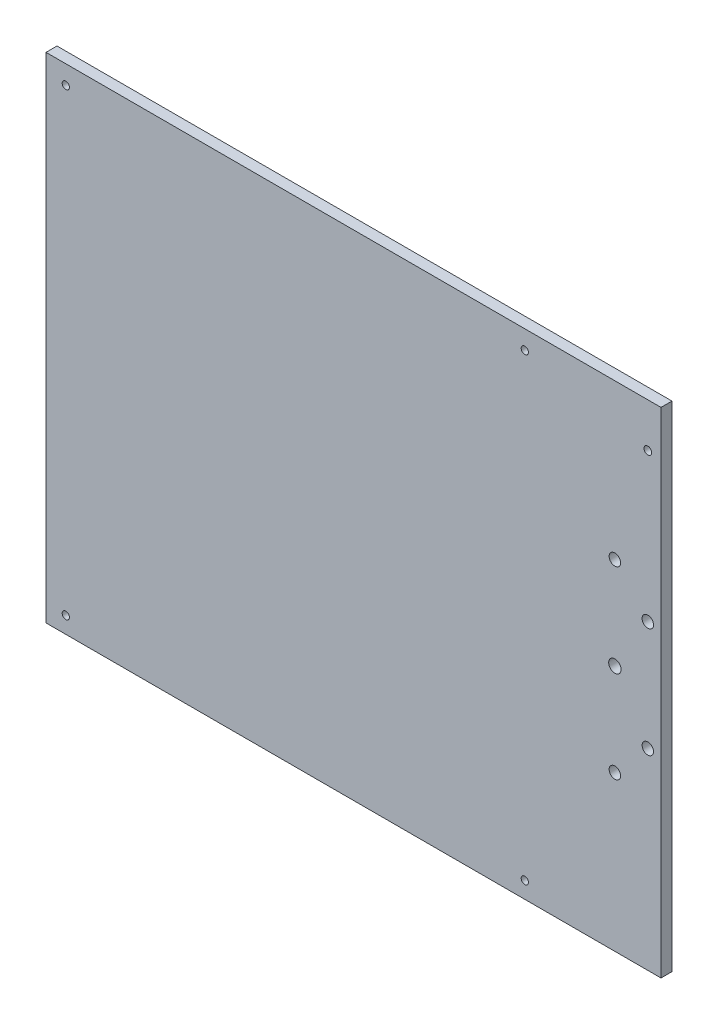
ISO-10303-21;
HEADER;
FILE_DESCRIPTION(('STEP AP214'),'2;1');
FILE_NAME('part.step','',(''),(''),'','','');
FILE_SCHEMA(('AUTOMOTIVE_DESIGN { 1 0 10303 214 1 1 1 1 }'));
ENDSEC;
DATA;
#1=APPLICATION_CONTEXT('core data for automotive mechanical design processes');
#2=APPLICATION_PROTOCOL_DEFINITION('international standard','automotive_design',2000,#1);
#3=PRODUCT_CONTEXT('',#1,'mechanical');
#4=PRODUCT('Part','Part','',(#3));
#5=PRODUCT_RELATED_PRODUCT_CATEGORY('part','',(#4));
#6=PRODUCT_DEFINITION_FORMATION('','',#4);
#7=PRODUCT_DEFINITION_CONTEXT('part definition',#1,'design');
#8=PRODUCT_DEFINITION('design','',#6,#7);
#9=PRODUCT_DEFINITION_SHAPE('','',#8);
#10=(LENGTH_UNIT() NAMED_UNIT(*) SI_UNIT(.MILLI.,.METRE.));
#11=(NAMED_UNIT(*) PLANE_ANGLE_UNIT() SI_UNIT($,.RADIAN.));
#12=(NAMED_UNIT(*) SI_UNIT($,.STERADIAN.) SOLID_ANGLE_UNIT());
#13=UNCERTAINTY_MEASURE_WITH_UNIT(LENGTH_MEASURE(1.E-05),#10,'distance_accuracy_value','');
#14=(GEOMETRIC_REPRESENTATION_CONTEXT(3) GLOBAL_UNCERTAINTY_ASSIGNED_CONTEXT((#13)) GLOBAL_UNIT_ASSIGNED_CONTEXT((#10,
#11,#12)) REPRESENTATION_CONTEXT('',''));
#15=CARTESIAN_POINT('',(0.,0.,0.));
#16=DIRECTION('',(0.,0.,1.));
#17=DIRECTION('',(1.,0.,0.));
#18=AXIS2_PLACEMENT_3D('',#15,#16,#17);
#19=CARTESIAN_POINT('',(0.,20.,5.));
#20=DIRECTION('',(-1.,0.,0.));
#21=DIRECTION('',(0.,0.,1.));
#22=AXIS2_PLACEMENT_3D('',#19,#20,#21);
#23=PLANE('',#22);
#24=DIRECTION('',(0.,1.,0.));
#25=VECTOR('',#24,1.);
#26=CARTESIAN_POINT('',(0.,20.,0.));
#27=LINE('',#26,#25);
#28=CARTESIAN_POINT('',(0.,20.,0.));
#29=VERTEX_POINT('',#28);
#30=CARTESIAN_POINT('',(0.,245.,0.));
#31=VERTEX_POINT('',#30);
#32=EDGE_CURVE('E100',#29,#31,#27,.T.);
#33=ORIENTED_EDGE('',*,*,#32,.T.);
#34=DIRECTION('',(0.,0.,-1.));
#35=VECTOR('',#34,1.);
#36=CARTESIAN_POINT('',(0.,245.,5.));
#37=LINE('',#36,#35);
#38=CARTESIAN_POINT('',(0.,245.,5.));
#39=VERTEX_POINT('',#38);
#40=EDGE_CURVE('E11',#39,#31,#37,.T.);
#41=ORIENTED_EDGE('',*,*,#40,.F.);
#42=DIRECTION('',(0.,1.,0.));
#43=VECTOR('',#42,1.);
#44=CARTESIAN_POINT('',(0.,20.,5.));
#45=LINE('',#44,#43);
#46=CARTESIAN_POINT('',(0.,20.,5.));
#47=VERTEX_POINT('',#46);
#48=EDGE_CURVE('E88',#47,#39,#45,.T.);
#49=ORIENTED_EDGE('',*,*,#48,.F.);
#50=DIRECTION('',(0.,0.,-1.));
#51=VECTOR('',#50,1.);
#52=CARTESIAN_POINT('',(0.,20.,5.));
#53=LINE('',#52,#51);
#54=EDGE_CURVE('E96',#47,#29,#53,.T.);
#55=ORIENTED_EDGE('',*,*,#54,.T.);
#56=EDGE_LOOP('',(#33,#41,#49,#55));
#57=FACE_BOUND('',#56,.T.);
#58=ADVANCED_FACE('F37',(#57),#23,.F.);
#59=CARTESIAN_POINT('',(0.,245.,5.));
#60=DIRECTION('',(0.,-1.,0.));
#61=DIRECTION('',(1.,0.,0.));
#62=AXIS2_PLACEMENT_3D('',#59,#60,#61);
#63=PLANE('',#62);
#64=DIRECTION('',(-1.,0.,0.));
#65=VECTOR('',#64,1.);
#66=CARTESIAN_POINT('',(0.,245.,0.));
#67=LINE('',#66,#65);
#68=CARTESIAN_POINT('',(-280.,245.,0.));
#69=VERTEX_POINT('',#68);
#70=EDGE_CURVE('E92',#31,#69,#67,.T.);
#71=ORIENTED_EDGE('',*,*,#70,.T.);
#72=DIRECTION('',(0.,0.,-1.));
#73=VECTOR('',#72,1.);
#74=CARTESIAN_POINT('',(-280.,245.,5.));
#75=LINE('',#74,#73);
#76=CARTESIAN_POINT('',(-280.,245.,5.));
#77=VERTEX_POINT('',#76);
#78=EDGE_CURVE('E45',#77,#69,#75,.T.);
#79=ORIENTED_EDGE('',*,*,#78,.F.);
#80=DIRECTION('',(-1.,0.,0.));
#81=VECTOR('',#80,1.);
#82=CARTESIAN_POINT('',(0.,245.,5.));
#83=LINE('',#82,#81);
#84=EDGE_CURVE('E83',#39,#77,#83,.T.);
#85=ORIENTED_EDGE('',*,*,#84,.F.);
#86=ORIENTED_EDGE('',*,*,#40,.T.);
#87=EDGE_LOOP('',(#71,#79,#85,#86));
#88=FACE_BOUND('',#87,.T.);
#89=ADVANCED_FACE('F91',(#88),#63,.F.);
#90=CARTESIAN_POINT('',(-280.,20.,5.));
#91=DIRECTION('',(1.,0.,0.));
#92=DIRECTION('',(0.,0.,-1.));
#93=AXIS2_PLACEMENT_3D('',#90,#91,#92);
#94=PLANE('',#93);
#95=DIRECTION('',(0.,-1.,0.));
#96=VECTOR('',#95,1.);
#97=CARTESIAN_POINT('',(-280.,20.,0.));
#98=LINE('',#97,#96);
#99=CARTESIAN_POINT('',(-280.,20.,0.));
#100=VERTEX_POINT('',#99);
#101=EDGE_CURVE('E70',#69,#100,#98,.T.);
#102=ORIENTED_EDGE('',*,*,#101,.T.);
#103=DIRECTION('',(0.,0.,-1.));
#104=VECTOR('',#103,1.);
#105=CARTESIAN_POINT('',(-280.,20.,5.));
#106=LINE('',#105,#104);
#107=CARTESIAN_POINT('',(-280.,20.,5.));
#108=VERTEX_POINT('',#107);
#109=EDGE_CURVE('E93',#108,#100,#106,.T.);
#110=ORIENTED_EDGE('',*,*,#109,.F.);
#111=DIRECTION('',(0.,-1.,0.));
#112=VECTOR('',#111,1.);
#113=CARTESIAN_POINT('',(-280.,20.,5.));
#114=LINE('',#113,#112);
#115=EDGE_CURVE('E86',#77,#108,#114,.T.);
#116=ORIENTED_EDGE('',*,*,#115,.F.);
#117=ORIENTED_EDGE('',*,*,#78,.T.);
#118=EDGE_LOOP('',(#102,#110,#116,#117));
#119=FACE_BOUND('',#118,.T.);
#120=ADVANCED_FACE('F94',(#119),#94,.F.);
#121=CARTESIAN_POINT('',(0.,20.,5.));
#122=DIRECTION('',(0.,1.,0.));
#123=DIRECTION('',(-1.,0.,0.));
#124=AXIS2_PLACEMENT_3D('',#121,#122,#123);
#125=PLANE('',#124);
#126=DIRECTION('',(1.,0.,0.));
#127=VECTOR('',#126,1.);
#128=CARTESIAN_POINT('',(0.,20.,0.));
#129=LINE('',#128,#127);
#130=EDGE_CURVE('E76',#100,#29,#129,.T.);
#131=ORIENTED_EDGE('',*,*,#130,.T.);
#132=ORIENTED_EDGE('',*,*,#54,.F.);
#133=DIRECTION('',(1.,0.,0.));
#134=VECTOR('',#133,1.);
#135=CARTESIAN_POINT('',(0.,20.,5.));
#136=LINE('',#135,#134);
#137=EDGE_CURVE('E53',#108,#47,#136,.T.);
#138=ORIENTED_EDGE('',*,*,#137,.F.);
#139=ORIENTED_EDGE('',*,*,#109,.T.);
#140=EDGE_LOOP('',(#131,#132,#138,#139));
#141=FACE_BOUND('',#140,.T.);
#142=ADVANCED_FACE('F108',(#141),#125,.F.);
#143=CARTESIAN_POINT('',(0.,0.,5.));
#144=DIRECTION('',(0.,0.,1.));
#145=DIRECTION('',(1.,0.,0.));
#146=AXIS2_PLACEMENT_3D('',#143,#144,#145);
#147=PLANE('',#146);
#148=CARTESIAN_POINT('',(-6.,225.,5.));
#149=DIRECTION('',(0.,0.,1.));
#150=DIRECTION('',(1.,0.,0.));
#151=AXIS2_PLACEMENT_3D('',#148,#149,#150);
#152=CIRCLE('',#151,1.75);
#153=CARTESIAN_POINT('',(-4.25,225.,5.));
#154=VERTEX_POINT('',#153);
#155=EDGE_CURVE('E167',#154,#154,#152,.T.);
#156=ORIENTED_EDGE('',*,*,#155,.F.);
#157=EDGE_LOOP('',(#156));
#158=FACE_BOUND('',#157,.T.);
#159=CARTESIAN_POINT('',(-21.,174.5,5.));
#160=DIRECTION('',(0.,0.,1.));
#161=DIRECTION('',(1.,0.,0.));
#162=AXIS2_PLACEMENT_3D('',#159,#160,#161);
#163=CIRCLE('',#162,2.6);
#164=CARTESIAN_POINT('',(-18.4,174.5,5.));
#165=VERTEX_POINT('',#164);
#166=EDGE_CURVE('E161',#165,#165,#163,.T.);
#167=ORIENTED_EDGE('',*,*,#166,.F.);
#168=EDGE_LOOP('',(#167));
#169=FACE_BOUND('',#168,.T.);
#170=CARTESIAN_POINT('',(-21.,132.5,5.));
#171=DIRECTION('',(0.,0.,1.));
#172=DIRECTION('',(1.,0.,0.));
#173=AXIS2_PLACEMENT_3D('',#170,#171,#172);
#174=CIRCLE('',#173,2.83064044469154);
#175=CARTESIAN_POINT('',(-18.1693595553085,132.5,5.));
#176=VERTEX_POINT('',#175);
#177=EDGE_CURVE('E155',#176,#176,#174,.T.);
#178=ORIENTED_EDGE('',*,*,#177,.F.);
#179=EDGE_LOOP('',(#178));
#180=FACE_BOUND('',#179,.T.);
#181=CARTESIAN_POINT('',(-21.,90.5,5.));
#182=DIRECTION('',(0.,0.,1.));
#183=DIRECTION('',(1.,0.,0.));
#184=AXIS2_PLACEMENT_3D('',#181,#182,#183);
#185=CIRCLE('',#184,2.60000000000001);
#186=CARTESIAN_POINT('',(-18.4,90.5,5.));
#187=VERTEX_POINT('',#186);
#188=EDGE_CURVE('E149',#187,#187,#185,.T.);
#189=ORIENTED_EDGE('',*,*,#188,.F.);
#190=EDGE_LOOP('',(#189));
#191=FACE_BOUND('',#190,.T.);
#192=CARTESIAN_POINT('',(-6.,157.5,5.));
#193=DIRECTION('',(0.,0.,1.));
#194=DIRECTION('',(1.,0.,0.));
#195=AXIS2_PLACEMENT_3D('',#192,#193,#194);
#196=CIRCLE('',#195,2.59999999999999);
#197=CARTESIAN_POINT('',(-3.40000000000001,157.5,5.));
#198=VERTEX_POINT('',#197);
#199=EDGE_CURVE('E143',#198,#198,#196,.T.);
#200=ORIENTED_EDGE('',*,*,#199,.F.);
#201=EDGE_LOOP('',(#200));
#202=FACE_BOUND('',#201,.T.);
#203=CARTESIAN_POINT('',(-6.,107.5,5.));
#204=DIRECTION('',(0.,0.,1.));
#205=DIRECTION('',(1.,0.,0.));
#206=AXIS2_PLACEMENT_3D('',#203,#204,#205);
#207=CIRCLE('',#206,2.6);
#208=CARTESIAN_POINT('',(-3.4,107.5,5.));
#209=VERTEX_POINT('',#208);
#210=EDGE_CURVE('E137',#209,#209,#207,.T.);
#211=ORIENTED_EDGE('',*,*,#210,.F.);
#212=EDGE_LOOP('',(#211));
#213=FACE_BOUND('',#212,.T.);
#214=CARTESIAN_POINT('',(-271.,27.5000000000032,5.));
#215=DIRECTION('',(0.,0.,1.));
#216=DIRECTION('',(1.,0.,0.));
#217=AXIS2_PLACEMENT_3D('',#214,#215,#216);
#218=CIRCLE('',#217,1.64999999999998);
#219=CARTESIAN_POINT('',(-269.35,27.5000000000032,5.));
#220=VERTEX_POINT('',#219);
#221=EDGE_CURVE('E131',#220,#220,#218,.T.);
#222=ORIENTED_EDGE('',*,*,#221,.F.);
#223=EDGE_LOOP('',(#222));
#224=FACE_BOUND('',#223,.T.);
#225=CARTESIAN_POINT('',(-62.,27.5000000000032,5.));
#226=DIRECTION('',(0.,0.,1.));
#227=DIRECTION('',(1.,0.,0.));
#228=AXIS2_PLACEMENT_3D('',#225,#226,#227);
#229=CIRCLE('',#228,1.64999999999999);
#230=CARTESIAN_POINT('',(-60.35,27.5000000000032,5.));
#231=VERTEX_POINT('',#230);
#232=EDGE_CURVE('E125',#231,#231,#229,.T.);
#233=ORIENTED_EDGE('',*,*,#232,.F.);
#234=EDGE_LOOP('',(#233));
#235=FACE_BOUND('',#234,.T.);
#236=CARTESIAN_POINT('',(-271.,236.500000000003,5.));
#237=DIRECTION('',(0.,0.,1.));
#238=DIRECTION('',(1.,0.,0.));
#239=AXIS2_PLACEMENT_3D('',#236,#237,#238);
#240=CIRCLE('',#239,1.64999999999998);
#241=CARTESIAN_POINT('',(-269.35,236.500000000003,5.));
#242=VERTEX_POINT('',#241);
#243=EDGE_CURVE('E119',#242,#242,#240,.T.);
#244=ORIENTED_EDGE('',*,*,#243,.F.);
#245=EDGE_LOOP('',(#244));
#246=FACE_BOUND('',#245,.T.);
#247=CARTESIAN_POINT('',(-62.,236.500000000003,5.));
#248=DIRECTION('',(0.,0.,1.));
#249=DIRECTION('',(1.,0.,0.));
#250=AXIS2_PLACEMENT_3D('',#247,#248,#249);
#251=CIRCLE('',#250,1.64999999999999);
#252=CARTESIAN_POINT('',(-60.35,236.500000000003,5.));
#253=VERTEX_POINT('',#252);
#254=EDGE_CURVE('E103',#253,#253,#251,.T.);
#255=ORIENTED_EDGE('',*,*,#254,.F.);
#256=EDGE_LOOP('',(#255));
#257=FACE_BOUND('',#256,.T.);
#258=ORIENTED_EDGE('',*,*,#48,.T.);
#259=ORIENTED_EDGE('',*,*,#84,.T.);
#260=ORIENTED_EDGE('',*,*,#115,.T.);
#261=ORIENTED_EDGE('',*,*,#137,.T.);
#262=EDGE_LOOP('',(#258,#259,#260,#261));
#263=FACE_BOUND('',#262,.T.);
#264=ADVANCED_FACE('F84',(#158,#169,#180,#191,#202,#213,#224,#235,#246,#257,#263),#147,.T.);
#265=CARTESIAN_POINT('',(0.,0.,0.));
#266=DIRECTION('',(0.,0.,1.));
#267=DIRECTION('',(1.,0.,0.));
#268=AXIS2_PLACEMENT_3D('',#265,#266,#267);
#269=PLANE('',#268);
#270=CARTESIAN_POINT('',(-6.,225.,0.));
#271=DIRECTION('',(0.,0.,-1.));
#272=DIRECTION('',(-1.,0.,0.));
#273=AXIS2_PLACEMENT_3D('',#270,#271,#272);
#274=CIRCLE('',#273,1.75);
#275=CARTESIAN_POINT('',(-7.75,225.,0.));
#276=VERTEX_POINT('',#275);
#277=EDGE_CURVE('E170',#276,#276,#274,.T.);
#278=ORIENTED_EDGE('',*,*,#277,.F.);
#279=EDGE_LOOP('',(#278));
#280=FACE_BOUND('',#279,.T.);
#281=CARTESIAN_POINT('',(-21.,174.5,0.));
#282=DIRECTION('',(0.,0.,-1.));
#283=DIRECTION('',(-1.,0.,0.));
#284=AXIS2_PLACEMENT_3D('',#281,#282,#283);
#285=CIRCLE('',#284,2.6);
#286=CARTESIAN_POINT('',(-23.6,174.5,0.));
#287=VERTEX_POINT('',#286);
#288=EDGE_CURVE('E164',#287,#287,#285,.T.);
#289=ORIENTED_EDGE('',*,*,#288,.F.);
#290=EDGE_LOOP('',(#289));
#291=FACE_BOUND('',#290,.T.);
#292=CARTESIAN_POINT('',(-21.,132.5,0.));
#293=DIRECTION('',(0.,0.,-1.));
#294=DIRECTION('',(-1.,0.,0.));
#295=AXIS2_PLACEMENT_3D('',#292,#293,#294);
#296=CIRCLE('',#295,2.83064044469154);
#297=CARTESIAN_POINT('',(-23.8306404446915,132.5,0.));
#298=VERTEX_POINT('',#297);
#299=EDGE_CURVE('E158',#298,#298,#296,.T.);
#300=ORIENTED_EDGE('',*,*,#299,.F.);
#301=EDGE_LOOP('',(#300));
#302=FACE_BOUND('',#301,.T.);
#303=CARTESIAN_POINT('',(-21.,90.5,0.));
#304=DIRECTION('',(0.,0.,-1.));
#305=DIRECTION('',(-1.,0.,0.));
#306=AXIS2_PLACEMENT_3D('',#303,#304,#305);
#307=CIRCLE('',#306,2.60000000000001);
#308=CARTESIAN_POINT('',(-23.6,90.5,0.));
#309=VERTEX_POINT('',#308);
#310=EDGE_CURVE('E152',#309,#309,#307,.T.);
#311=ORIENTED_EDGE('',*,*,#310,.F.);
#312=EDGE_LOOP('',(#311));
#313=FACE_BOUND('',#312,.T.);
#314=CARTESIAN_POINT('',(-6.,157.5,0.));
#315=DIRECTION('',(0.,0.,-1.));
#316=DIRECTION('',(-1.,0.,0.));
#317=AXIS2_PLACEMENT_3D('',#314,#315,#316);
#318=CIRCLE('',#317,2.59999999999999);
#319=CARTESIAN_POINT('',(-8.59999999999999,157.5,0.));
#320=VERTEX_POINT('',#319);
#321=EDGE_CURVE('E146',#320,#320,#318,.T.);
#322=ORIENTED_EDGE('',*,*,#321,.F.);
#323=EDGE_LOOP('',(#322));
#324=FACE_BOUND('',#323,.T.);
#325=CARTESIAN_POINT('',(-6.,107.5,0.));
#326=DIRECTION('',(0.,0.,-1.));
#327=DIRECTION('',(-1.,0.,0.));
#328=AXIS2_PLACEMENT_3D('',#325,#326,#327);
#329=CIRCLE('',#328,2.6);
#330=CARTESIAN_POINT('',(-8.6,107.5,0.));
#331=VERTEX_POINT('',#330);
#332=EDGE_CURVE('E140',#331,#331,#329,.T.);
#333=ORIENTED_EDGE('',*,*,#332,.F.);
#334=EDGE_LOOP('',(#333));
#335=FACE_BOUND('',#334,.T.);
#336=CARTESIAN_POINT('',(-271.,27.5000000000032,0.));
#337=DIRECTION('',(0.,0.,-1.));
#338=DIRECTION('',(-1.,0.,0.));
#339=AXIS2_PLACEMENT_3D('',#336,#337,#338);
#340=CIRCLE('',#339,1.64999999999998);
#341=CARTESIAN_POINT('',(-272.65,27.5000000000032,0.));
#342=VERTEX_POINT('',#341);
#343=EDGE_CURVE('E134',#342,#342,#340,.T.);
#344=ORIENTED_EDGE('',*,*,#343,.F.);
#345=EDGE_LOOP('',(#344));
#346=FACE_BOUND('',#345,.T.);
#347=CARTESIAN_POINT('',(-62.,27.5000000000032,0.));
#348=DIRECTION('',(0.,0.,-1.));
#349=DIRECTION('',(-1.,0.,0.));
#350=AXIS2_PLACEMENT_3D('',#347,#348,#349);
#351=CIRCLE('',#350,1.64999999999998);
#352=CARTESIAN_POINT('',(-63.65,27.5000000000032,0.));
#353=VERTEX_POINT('',#352);
#354=EDGE_CURVE('E128',#353,#353,#351,.T.);
#355=ORIENTED_EDGE('',*,*,#354,.F.);
#356=EDGE_LOOP('',(#355));
#357=FACE_BOUND('',#356,.T.);
#358=CARTESIAN_POINT('',(-271.,236.500000000003,0.));
#359=DIRECTION('',(0.,0.,-1.));
#360=DIRECTION('',(-1.,0.,0.));
#361=AXIS2_PLACEMENT_3D('',#358,#359,#360);
#362=CIRCLE('',#361,1.64999999999998);
#363=CARTESIAN_POINT('',(-272.65,236.500000000003,0.));
#364=VERTEX_POINT('',#363);
#365=EDGE_CURVE('E122',#364,#364,#362,.T.);
#366=ORIENTED_EDGE('',*,*,#365,.F.);
#367=EDGE_LOOP('',(#366));
#368=FACE_BOUND('',#367,.T.);
#369=CARTESIAN_POINT('',(-62.,236.500000000003,0.));
#370=DIRECTION('',(0.,0.,-1.));
#371=DIRECTION('',(-1.,0.,0.));
#372=AXIS2_PLACEMENT_3D('',#369,#370,#371);
#373=CIRCLE('',#372,1.64999999999998);
#374=CARTESIAN_POINT('',(-63.65,236.500000000003,0.));
#375=VERTEX_POINT('',#374);
#376=EDGE_CURVE('E116',#375,#375,#373,.T.);
#377=ORIENTED_EDGE('',*,*,#376,.F.);
#378=EDGE_LOOP('',(#377));
#379=FACE_BOUND('',#378,.T.);
#380=ORIENTED_EDGE('',*,*,#32,.F.);
#381=ORIENTED_EDGE('',*,*,#130,.F.);
#382=ORIENTED_EDGE('',*,*,#101,.F.);
#383=ORIENTED_EDGE('',*,*,#70,.F.);
#384=EDGE_LOOP('',(#380,#381,#382,#383));
#385=FACE_BOUND('',#384,.T.);
#386=ADVANCED_FACE('F111',(#280,#291,#302,#313,#324,#335,#346,#357,#368,#379,#385),#269,.F.);
#387=CARTESIAN_POINT('',(-62.,236.500000000003,0.));
#388=DIRECTION('',(0.,0.,-1.));
#389=DIRECTION('',(-1.,0.,0.));
#390=AXIS2_PLACEMENT_3D('',#387,#388,#389);
#391=CYLINDRICAL_SURFACE('',#390,1.64999999999999);
#392=ORIENTED_EDGE('',*,*,#376,.T.);
#393=EDGE_LOOP('',(#392));
#394=FACE_BOUND('',#393,.T.);
#395=ORIENTED_EDGE('',*,*,#254,.T.);
#396=EDGE_LOOP('',(#395));
#397=FACE_BOUND('',#396,.T.);
#398=ADVANCED_FACE('F178',(#394,#397),#391,.F.);
#399=CARTESIAN_POINT('',(-271.,236.500000000003,0.));
#400=DIRECTION('',(0.,0.,-1.));
#401=DIRECTION('',(-1.,0.,0.));
#402=AXIS2_PLACEMENT_3D('',#399,#400,#401);
#403=CYLINDRICAL_SURFACE('',#402,1.64999999999998);
#404=ORIENTED_EDGE('',*,*,#365,.T.);
#405=EDGE_LOOP('',(#404));
#406=FACE_BOUND('',#405,.T.);
#407=ORIENTED_EDGE('',*,*,#243,.T.);
#408=EDGE_LOOP('',(#407));
#409=FACE_BOUND('',#408,.T.);
#410=ADVANCED_FACE('F200',(#406,#409),#403,.F.);
#411=CARTESIAN_POINT('',(-62.,27.5000000000032,0.));
#412=DIRECTION('',(0.,0.,-1.));
#413=DIRECTION('',(-1.,0.,0.));
#414=AXIS2_PLACEMENT_3D('',#411,#412,#413);
#415=CYLINDRICAL_SURFACE('',#414,1.64999999999999);
#416=ORIENTED_EDGE('',*,*,#354,.T.);
#417=EDGE_LOOP('',(#416));
#418=FACE_BOUND('',#417,.T.);
#419=ORIENTED_EDGE('',*,*,#232,.T.);
#420=EDGE_LOOP('',(#419));
#421=FACE_BOUND('',#420,.T.);
#422=ADVANCED_FACE('F246',(#418,#421),#415,.F.);
#423=CARTESIAN_POINT('',(-271.,27.5000000000032,0.));
#424=DIRECTION('',(0.,0.,-1.));
#425=DIRECTION('',(-1.,0.,0.));
#426=AXIS2_PLACEMENT_3D('',#423,#424,#425);
#427=CYLINDRICAL_SURFACE('',#426,1.64999999999998);
#428=ORIENTED_EDGE('',*,*,#343,.T.);
#429=EDGE_LOOP('',(#428));
#430=FACE_BOUND('',#429,.T.);
#431=ORIENTED_EDGE('',*,*,#221,.T.);
#432=EDGE_LOOP('',(#431));
#433=FACE_BOUND('',#432,.T.);
#434=ADVANCED_FACE('F257',(#430,#433),#427,.F.);
#435=CARTESIAN_POINT('',(-6.,107.5,10.));
#436=DIRECTION('',(0.,0.,-1.));
#437=DIRECTION('',(-1.,0.,0.));
#438=AXIS2_PLACEMENT_3D('',#435,#436,#437);
#439=CYLINDRICAL_SURFACE('',#438,2.6);
#440=ORIENTED_EDGE('',*,*,#210,.T.);
#441=EDGE_LOOP('',(#440));
#442=FACE_BOUND('',#441,.T.);
#443=ORIENTED_EDGE('',*,*,#332,.T.);
#444=EDGE_LOOP('',(#443));
#445=FACE_BOUND('',#444,.T.);
#446=ADVANCED_FACE('F267',(#442,#445),#439,.F.);
#447=CARTESIAN_POINT('',(-6.,157.5,10.));
#448=DIRECTION('',(0.,0.,-1.));
#449=DIRECTION('',(-1.,0.,0.));
#450=AXIS2_PLACEMENT_3D('',#447,#448,#449);
#451=CYLINDRICAL_SURFACE('',#450,2.59999999999999);
#452=ORIENTED_EDGE('',*,*,#199,.T.);
#453=EDGE_LOOP('',(#452));
#454=FACE_BOUND('',#453,.T.);
#455=ORIENTED_EDGE('',*,*,#321,.T.);
#456=EDGE_LOOP('',(#455));
#457=FACE_BOUND('',#456,.T.);
#458=ADVANCED_FACE('F287',(#454,#457),#451,.F.);
#459=CARTESIAN_POINT('',(-21.,90.5,10.));
#460=DIRECTION('',(0.,0.,-1.));
#461=DIRECTION('',(-1.,0.,0.));
#462=AXIS2_PLACEMENT_3D('',#459,#460,#461);
#463=CYLINDRICAL_SURFACE('',#462,2.60000000000001);
#464=ORIENTED_EDGE('',*,*,#188,.T.);
#465=EDGE_LOOP('',(#464));
#466=FACE_BOUND('',#465,.T.);
#467=ORIENTED_EDGE('',*,*,#310,.T.);
#468=EDGE_LOOP('',(#467));
#469=FACE_BOUND('',#468,.T.);
#470=ADVANCED_FACE('F297',(#466,#469),#463,.F.);
#471=CARTESIAN_POINT('',(-21.,132.5,10.));
#472=DIRECTION('',(0.,0.,-1.));
#473=DIRECTION('',(-1.,0.,0.));
#474=AXIS2_PLACEMENT_3D('',#471,#472,#473);
#475=CYLINDRICAL_SURFACE('',#474,2.83064044469154);
#476=ORIENTED_EDGE('',*,*,#177,.T.);
#477=EDGE_LOOP('',(#476));
#478=FACE_BOUND('',#477,.T.);
#479=ORIENTED_EDGE('',*,*,#299,.T.);
#480=EDGE_LOOP('',(#479));
#481=FACE_BOUND('',#480,.T.);
#482=ADVANCED_FACE('F307',(#478,#481),#475,.F.);
#483=CARTESIAN_POINT('',(-21.,174.5,10.));
#484=DIRECTION('',(0.,0.,-1.));
#485=DIRECTION('',(-1.,0.,0.));
#486=AXIS2_PLACEMENT_3D('',#483,#484,#485);
#487=CYLINDRICAL_SURFACE('',#486,2.6);
#488=ORIENTED_EDGE('',*,*,#166,.T.);
#489=EDGE_LOOP('',(#488));
#490=FACE_BOUND('',#489,.T.);
#491=ORIENTED_EDGE('',*,*,#288,.T.);
#492=EDGE_LOOP('',(#491));
#493=FACE_BOUND('',#492,.T.);
#494=ADVANCED_FACE('F317',(#490,#493),#487,.F.);
#495=CARTESIAN_POINT('',(-6.,225.,10.));
#496=DIRECTION('',(0.,0.,-1.));
#497=DIRECTION('',(-1.,0.,0.));
#498=AXIS2_PLACEMENT_3D('',#495,#496,#497);
#499=CYLINDRICAL_SURFACE('',#498,1.75);
#500=ORIENTED_EDGE('',*,*,#155,.T.);
#501=EDGE_LOOP('',(#500));
#502=FACE_BOUND('',#501,.T.);
#503=ORIENTED_EDGE('',*,*,#277,.T.);
#504=EDGE_LOOP('',(#503));
#505=FACE_BOUND('',#504,.T.);
#506=ADVANCED_FACE('F174',(#502,#505),#499,.F.);
#507=CLOSED_SHELL('',(#58,#89,#120,#142,#264,#386,#398,#410,#422,#434,#446,#458,#470,#482,#494,#506));
#508=MANIFOLD_SOLID_BREP('B2',#507);
#509=ADVANCED_BREP_SHAPE_REPRESENTATION('',(#18,#508),#14);
#510=SHAPE_DEFINITION_REPRESENTATION(#9,#509);
ENDSEC;
END-ISO-10303-21;
